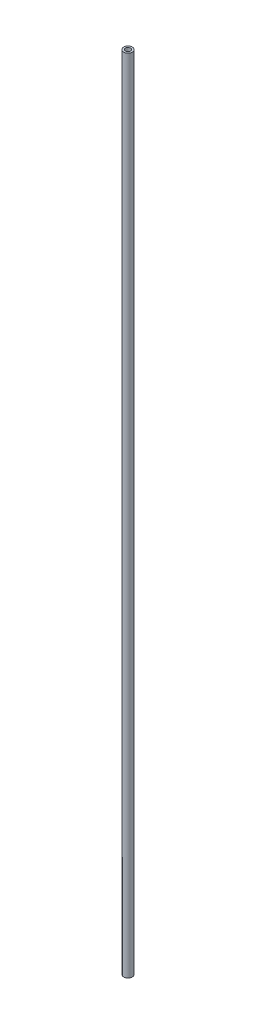
ISO-10303-21;
HEADER;
FILE_DESCRIPTION(('STEP AP214'),'2;1');
FILE_NAME('part.step','',(''),(''),'','','');
FILE_SCHEMA(('AUTOMOTIVE_DESIGN { 1 0 10303 214 1 1 1 1 }'));
ENDSEC;
DATA;
#1=APPLICATION_CONTEXT('core data for automotive mechanical design processes');
#2=APPLICATION_PROTOCOL_DEFINITION('international standard','automotive_design',2000,#1);
#3=PRODUCT_CONTEXT('',#1,'mechanical');
#4=PRODUCT('Part','Part','',(#3));
#5=PRODUCT_RELATED_PRODUCT_CATEGORY('part','',(#4));
#6=PRODUCT_DEFINITION_FORMATION('','',#4);
#7=PRODUCT_DEFINITION_CONTEXT('part definition',#1,'design');
#8=PRODUCT_DEFINITION('design','',#6,#7);
#9=PRODUCT_DEFINITION_SHAPE('','',#8);
#10=(LENGTH_UNIT() NAMED_UNIT(*) SI_UNIT(.MILLI.,.METRE.));
#11=(NAMED_UNIT(*) PLANE_ANGLE_UNIT() SI_UNIT($,.RADIAN.));
#12=(NAMED_UNIT(*) SI_UNIT($,.STERADIAN.) SOLID_ANGLE_UNIT());
#13=UNCERTAINTY_MEASURE_WITH_UNIT(LENGTH_MEASURE(1.E-05),#10,'distance_accuracy_value','');
#14=(GEOMETRIC_REPRESENTATION_CONTEXT(3) GLOBAL_UNCERTAINTY_ASSIGNED_CONTEXT((#13)) GLOBAL_UNIT_ASSIGNED_CONTEXT((#10,
#11,#12)) REPRESENTATION_CONTEXT('',''));
#15=CARTESIAN_POINT('',(0.,0.,0.));
#16=DIRECTION('',(0.,0.,1.));
#17=DIRECTION('',(1.,0.,0.));
#18=AXIS2_PLACEMENT_3D('',#15,#16,#17);
#19=CARTESIAN_POINT('',(0.,550.,0.));
#20=DIRECTION('',(0.,-1.,0.));
#21=DIRECTION('',(0.,0.,-1.));
#22=AXIS2_PLACEMENT_3D('',#19,#20,#21);
#23=CYLINDRICAL_SURFACE('',#22,3.);
#24=CARTESIAN_POINT('',(0.,550.,0.));
#25=DIRECTION('',(0.,1.,0.));
#26=DIRECTION('',(0.,0.,1.));
#27=AXIS2_PLACEMENT_3D('',#24,#25,#26);
#28=CIRCLE('',#27,3.);
#29=CARTESIAN_POINT('',(0.,550.,3.));
#30=VERTEX_POINT('',#29);
#31=EDGE_CURVE('E10',#30,#30,#28,.T.);
#32=ORIENTED_EDGE('',*,*,#31,.F.);
#33=EDGE_LOOP('',(#32));
#34=FACE_BOUND('',#33,.T.);
#35=CARTESIAN_POINT('',(0.,0.,0.));
#36=DIRECTION('',(0.,1.,0.));
#37=DIRECTION('',(0.,0.,1.));
#38=AXIS2_PLACEMENT_3D('',#35,#36,#37);
#39=CIRCLE('',#38,3.);
#40=CARTESIAN_POINT('',(0.,0.,3.));
#41=VERTEX_POINT('',#40);
#42=EDGE_CURVE('E34',#41,#41,#39,.T.);
#43=ORIENTED_EDGE('',*,*,#42,.T.);
#44=EDGE_LOOP('',(#43));
#45=FACE_BOUND('',#44,.T.);
#46=ADVANCED_FACE('F31',(#34,#45),#23,.T.);
#47=CARTESIAN_POINT('',(0.,550.,0.));
#48=DIRECTION('',(0.,1.,0.));
#49=DIRECTION('',(0.,0.,1.));
#50=AXIS2_PLACEMENT_3D('',#47,#48,#49);
#51=PLANE('',#50);
#52=CARTESIAN_POINT('',(0.,550.,0.));
#53=DIRECTION('',(0.,1.,0.));
#54=DIRECTION('',(0.,0.,1.));
#55=AXIS2_PLACEMENT_3D('',#52,#53,#54);
#56=CIRCLE('',#55,1.75);
#57=CARTESIAN_POINT('',(0.,550.,1.75));
#58=VERTEX_POINT('',#57);
#59=EDGE_CURVE('E43',#58,#58,#56,.T.);
#60=ORIENTED_EDGE('',*,*,#59,.F.);
#61=EDGE_LOOP('',(#60));
#62=FACE_BOUND('',#61,.T.);
#63=ORIENTED_EDGE('',*,*,#31,.T.);
#64=EDGE_LOOP('',(#63));
#65=FACE_BOUND('',#64,.T.);
#66=ADVANCED_FACE('F58',(#62,#65),#51,.T.);
#67=CARTESIAN_POINT('',(0.,0.,0.));
#68=DIRECTION('',(0.,1.,0.));
#69=DIRECTION('',(0.,0.,1.));
#70=AXIS2_PLACEMENT_3D('',#67,#68,#69);
#71=PLANE('',#70);
#72=ORIENTED_EDGE('',*,*,#42,.F.);
#73=EDGE_LOOP('',(#72));
#74=FACE_BOUND('',#73,.T.);
#75=ADVANCED_FACE('F54',(#74),#71,.F.);
#76=CARTESIAN_POINT('',(0.,540.,0.));
#77=DIRECTION('',(0.,1.,0.));
#78=DIRECTION('',(0.,0.,1.));
#79=AXIS2_PLACEMENT_3D('',#76,#77,#78);
#80=CYLINDRICAL_SURFACE('',#79,1.75);
#81=CARTESIAN_POINT('',(0.,540.,0.));
#82=DIRECTION('',(0.,1.,0.));
#83=DIRECTION('',(0.,0.,1.));
#84=AXIS2_PLACEMENT_3D('',#81,#82,#83);
#85=CIRCLE('',#84,1.75);
#86=CARTESIAN_POINT('',(0.,540.,1.75));
#87=VERTEX_POINT('',#86);
#88=EDGE_CURVE('E41',#87,#87,#85,.T.);
#89=ORIENTED_EDGE('',*,*,#88,.F.);
#90=EDGE_LOOP('',(#89));
#91=FACE_BOUND('',#90,.T.);
#92=ORIENTED_EDGE('',*,*,#59,.T.);
#93=EDGE_LOOP('',(#92));
#94=FACE_BOUND('',#93,.T.);
#95=ADVANCED_FACE('F51',(#91,#94),#80,.F.);
#96=CARTESIAN_POINT('',(0.,540.,0.));
#97=DIRECTION('',(0.,1.,0.));
#98=DIRECTION('',(0.,0.,1.));
#99=AXIS2_PLACEMENT_3D('',#96,#97,#98);
#100=PLANE('',#99);
#101=ORIENTED_EDGE('',*,*,#88,.T.);
#102=EDGE_LOOP('',(#101));
#103=FACE_BOUND('',#102,.T.);
#104=ADVANCED_FACE('F49',(#103),#100,.T.);
#105=CLOSED_SHELL('',(#46,#66,#75,#95,#104));
#106=MANIFOLD_SOLID_BREP('B2',#105);
#107=ADVANCED_BREP_SHAPE_REPRESENTATION('',(#18,#106),#14);
#108=SHAPE_DEFINITION_REPRESENTATION(#9,#107);
ENDSEC;
END-ISO-10303-21;
